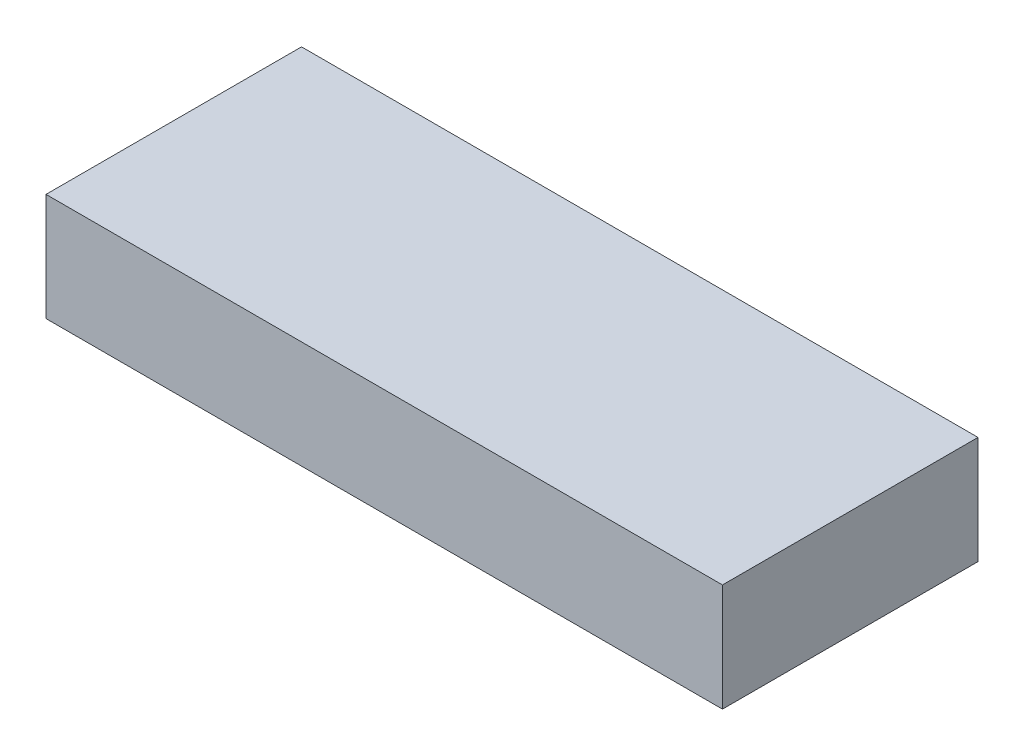
ISO-10303-21;
HEADER;
FILE_DESCRIPTION(('STEP AP214'),'2;1');
FILE_NAME('part.step','',(''),(''),'','','');
FILE_SCHEMA(('AUTOMOTIVE_DESIGN { 1 0 10303 214 1 1 1 1 }'));
ENDSEC;
DATA;
#1=APPLICATION_CONTEXT('core data for automotive mechanical design processes');
#2=APPLICATION_PROTOCOL_DEFINITION('international standard','automotive_design',2000,#1);
#3=PRODUCT_CONTEXT('',#1,'mechanical');
#4=PRODUCT('Part','Part','',(#3));
#5=PRODUCT_RELATED_PRODUCT_CATEGORY('part','',(#4));
#6=PRODUCT_DEFINITION_FORMATION('','',#4);
#7=PRODUCT_DEFINITION_CONTEXT('part definition',#1,'design');
#8=PRODUCT_DEFINITION('design','',#6,#7);
#9=PRODUCT_DEFINITION_SHAPE('','',#8);
#10=(LENGTH_UNIT() NAMED_UNIT(*) SI_UNIT(.MILLI.,.METRE.));
#11=(NAMED_UNIT(*) PLANE_ANGLE_UNIT() SI_UNIT($,.RADIAN.));
#12=(NAMED_UNIT(*) SI_UNIT($,.STERADIAN.) SOLID_ANGLE_UNIT());
#13=UNCERTAINTY_MEASURE_WITH_UNIT(LENGTH_MEASURE(1.E-05),#10,'distance_accuracy_value','');
#14=(GEOMETRIC_REPRESENTATION_CONTEXT(3) GLOBAL_UNCERTAINTY_ASSIGNED_CONTEXT((#13)) GLOBAL_UNIT_ASSIGNED_CONTEXT((#10,
#11,#12)) REPRESENTATION_CONTEXT('',''));
#15=CARTESIAN_POINT('',(0.,0.,0.));
#16=DIRECTION('',(0.,0.,1.));
#17=DIRECTION('',(1.,0.,0.));
#18=AXIS2_PLACEMENT_3D('',#15,#16,#17);
#19=CARTESIAN_POINT('',(-51.7446808510639,8.,-7.88297872340427));
#20=DIRECTION('',(1.,0.,0.));
#21=DIRECTION('',(0.,0.,-1.));
#22=AXIS2_PLACEMENT_3D('',#19,#20,#21);
#23=PLANE('',#22);
#24=DIRECTION('',(0.,0.,1.));
#25=VECTOR('',#24,1.);
#26=CARTESIAN_POINT('',(-51.7446808510639,0.,-7.88297872340427));
#27=LINE('',#26,#25);
#28=CARTESIAN_POINT('',(-51.7446808510639,0.,-7.88297872340427));
#29=VERTEX_POINT('',#28);
#30=CARTESIAN_POINT('',(-51.7446808510639,0.,11.1170212765957));
#31=VERTEX_POINT('',#30);
#32=EDGE_CURVE('E96',#29,#31,#27,.T.);
#33=ORIENTED_EDGE('',*,*,#32,.T.);
#34=DIRECTION('',(0.,-1.,0.));
#35=VECTOR('',#34,1.);
#36=CARTESIAN_POINT('',(-51.7446808510639,8.,11.1170212765957));
#37=LINE('',#36,#35);
#38=CARTESIAN_POINT('',(-51.7446808510639,8.,11.1170212765957));
#39=VERTEX_POINT('',#38);
#40=EDGE_CURVE('E11',#39,#31,#37,.T.);
#41=ORIENTED_EDGE('',*,*,#40,.F.);
#42=DIRECTION('',(0.,0.,1.));
#43=VECTOR('',#42,1.);
#44=CARTESIAN_POINT('',(-51.7446808510639,8.,-7.88297872340427));
#45=LINE('',#44,#43);
#46=CARTESIAN_POINT('',(-51.7446808510639,8.,-7.88297872340427));
#47=VERTEX_POINT('',#46);
#48=EDGE_CURVE('E84',#47,#39,#45,.T.);
#49=ORIENTED_EDGE('',*,*,#48,.F.);
#50=DIRECTION('',(0.,-1.,0.));
#51=VECTOR('',#50,1.);
#52=CARTESIAN_POINT('',(-51.7446808510639,8.,-7.88297872340427));
#53=LINE('',#52,#51);
#54=EDGE_CURVE('E92',#47,#29,#53,.T.);
#55=ORIENTED_EDGE('',*,*,#54,.T.);
#56=EDGE_LOOP('',(#33,#41,#49,#55));
#57=FACE_BOUND('',#56,.T.);
#58=ADVANCED_FACE('F33',(#57),#23,.F.);
#59=CARTESIAN_POINT('',(-51.7446808510639,8.,11.1170212765957));
#60=DIRECTION('',(0.,0.,-1.));
#61=DIRECTION('',(-1.,0.,0.));
#62=AXIS2_PLACEMENT_3D('',#59,#60,#61);
#63=PLANE('',#62);
#64=DIRECTION('',(1.,0.,0.));
#65=VECTOR('',#64,1.);
#66=CARTESIAN_POINT('',(-51.7446808510639,0.,11.1170212765957));
#67=LINE('',#66,#65);
#68=CARTESIAN_POINT('',(-1.44468085106387,0.,11.1170212765957));
#69=VERTEX_POINT('',#68);
#70=EDGE_CURVE('E88',#31,#69,#67,.T.);
#71=ORIENTED_EDGE('',*,*,#70,.T.);
#72=DIRECTION('',(0.,-1.,0.));
#73=VECTOR('',#72,1.);
#74=CARTESIAN_POINT('',(-1.44468085106387,8.,11.1170212765957));
#75=LINE('',#74,#73);
#76=CARTESIAN_POINT('',(-1.44468085106387,8.,11.1170212765957));
#77=VERTEX_POINT('',#76);
#78=EDGE_CURVE('E41',#77,#69,#75,.T.);
#79=ORIENTED_EDGE('',*,*,#78,.F.);
#80=DIRECTION('',(1.,0.,0.));
#81=VECTOR('',#80,1.);
#82=CARTESIAN_POINT('',(-51.7446808510639,8.,11.1170212765957));
#83=LINE('',#82,#81);
#84=EDGE_CURVE('E79',#39,#77,#83,.T.);
#85=ORIENTED_EDGE('',*,*,#84,.F.);
#86=ORIENTED_EDGE('',*,*,#40,.T.);
#87=EDGE_LOOP('',(#71,#79,#85,#86));
#88=FACE_BOUND('',#87,.T.);
#89=ADVANCED_FACE('F87',(#88),#63,.F.);
#90=CARTESIAN_POINT('',(-1.44468085106387,8.,-7.88297872340427));
#91=DIRECTION('',(-1.,0.,0.));
#92=DIRECTION('',(0.,0.,1.));
#93=AXIS2_PLACEMENT_3D('',#90,#91,#92);
#94=PLANE('',#93);
#95=DIRECTION('',(0.,0.,-1.));
#96=VECTOR('',#95,1.);
#97=CARTESIAN_POINT('',(-1.44468085106387,0.,-7.88297872340427));
#98=LINE('',#97,#96);
#99=CARTESIAN_POINT('',(-1.44468085106387,0.,-7.88297872340427));
#100=VERTEX_POINT('',#99);
#101=EDGE_CURVE('E66',#69,#100,#98,.T.);
#102=ORIENTED_EDGE('',*,*,#101,.T.);
#103=DIRECTION('',(0.,-1.,0.));
#104=VECTOR('',#103,1.);
#105=CARTESIAN_POINT('',(-1.44468085106387,8.,-7.88297872340427));
#106=LINE('',#105,#104);
#107=CARTESIAN_POINT('',(-1.44468085106387,8.,-7.88297872340427));
#108=VERTEX_POINT('',#107);
#109=EDGE_CURVE('E89',#108,#100,#106,.T.);
#110=ORIENTED_EDGE('',*,*,#109,.F.);
#111=DIRECTION('',(0.,0.,-1.));
#112=VECTOR('',#111,1.);
#113=CARTESIAN_POINT('',(-1.44468085106387,8.,-7.88297872340427));
#114=LINE('',#113,#112);
#115=EDGE_CURVE('E82',#77,#108,#114,.T.);
#116=ORIENTED_EDGE('',*,*,#115,.F.);
#117=ORIENTED_EDGE('',*,*,#78,.T.);
#118=EDGE_LOOP('',(#102,#110,#116,#117));
#119=FACE_BOUND('',#118,.T.);
#120=ADVANCED_FACE('F90',(#119),#94,.F.);
#121=CARTESIAN_POINT('',(-51.7446808510639,8.,-7.88297872340427));
#122=DIRECTION('',(0.,0.,1.));
#123=DIRECTION('',(1.,0.,0.));
#124=AXIS2_PLACEMENT_3D('',#121,#122,#123);
#125=PLANE('',#124);
#126=DIRECTION('',(-1.,0.,0.));
#127=VECTOR('',#126,1.);
#128=CARTESIAN_POINT('',(-51.7446808510639,0.,-7.88297872340427));
#129=LINE('',#128,#127);
#130=EDGE_CURVE('E72',#100,#29,#129,.T.);
#131=ORIENTED_EDGE('',*,*,#130,.T.);
#132=ORIENTED_EDGE('',*,*,#54,.F.);
#133=DIRECTION('',(-1.,0.,0.));
#134=VECTOR('',#133,1.);
#135=CARTESIAN_POINT('',(-51.7446808510639,8.,-7.88297872340427));
#136=LINE('',#135,#134);
#137=EDGE_CURVE('E49',#108,#47,#136,.T.);
#138=ORIENTED_EDGE('',*,*,#137,.F.);
#139=ORIENTED_EDGE('',*,*,#109,.T.);
#140=EDGE_LOOP('',(#131,#132,#138,#139));
#141=FACE_BOUND('',#140,.T.);
#142=ADVANCED_FACE('F103',(#141),#125,.F.);
#143=CARTESIAN_POINT('',(0.,8.,0.));
#144=DIRECTION('',(0.,1.,0.));
#145=DIRECTION('',(0.,0.,1.));
#146=AXIS2_PLACEMENT_3D('',#143,#144,#145);
#147=PLANE('',#146);
#148=ORIENTED_EDGE('',*,*,#48,.T.);
#149=ORIENTED_EDGE('',*,*,#84,.T.);
#150=ORIENTED_EDGE('',*,*,#115,.T.);
#151=ORIENTED_EDGE('',*,*,#137,.T.);
#152=EDGE_LOOP('',(#148,#149,#150,#151));
#153=FACE_BOUND('',#152,.T.);
#154=ADVANCED_FACE('F80',(#153),#147,.T.);
#155=CARTESIAN_POINT('',(0.,0.,0.));
#156=DIRECTION('',(0.,1.,0.));
#157=DIRECTION('',(0.,0.,1.));
#158=AXIS2_PLACEMENT_3D('',#155,#156,#157);
#159=PLANE('',#158);
#160=ORIENTED_EDGE('',*,*,#32,.F.);
#161=ORIENTED_EDGE('',*,*,#130,.F.);
#162=ORIENTED_EDGE('',*,*,#101,.F.);
#163=ORIENTED_EDGE('',*,*,#70,.F.);
#164=EDGE_LOOP('',(#160,#161,#162,#163));
#165=FACE_BOUND('',#164,.T.);
#166=ADVANCED_FACE('F106',(#165),#159,.F.);
#167=CLOSED_SHELL('',(#58,#89,#120,#142,#154,#166));
#168=MANIFOLD_SOLID_BREP('B2',#167);
#169=ADVANCED_BREP_SHAPE_REPRESENTATION('',(#18,#168),#14);
#170=SHAPE_DEFINITION_REPRESENTATION(#9,#169);
ENDSEC;
END-ISO-10303-21;
